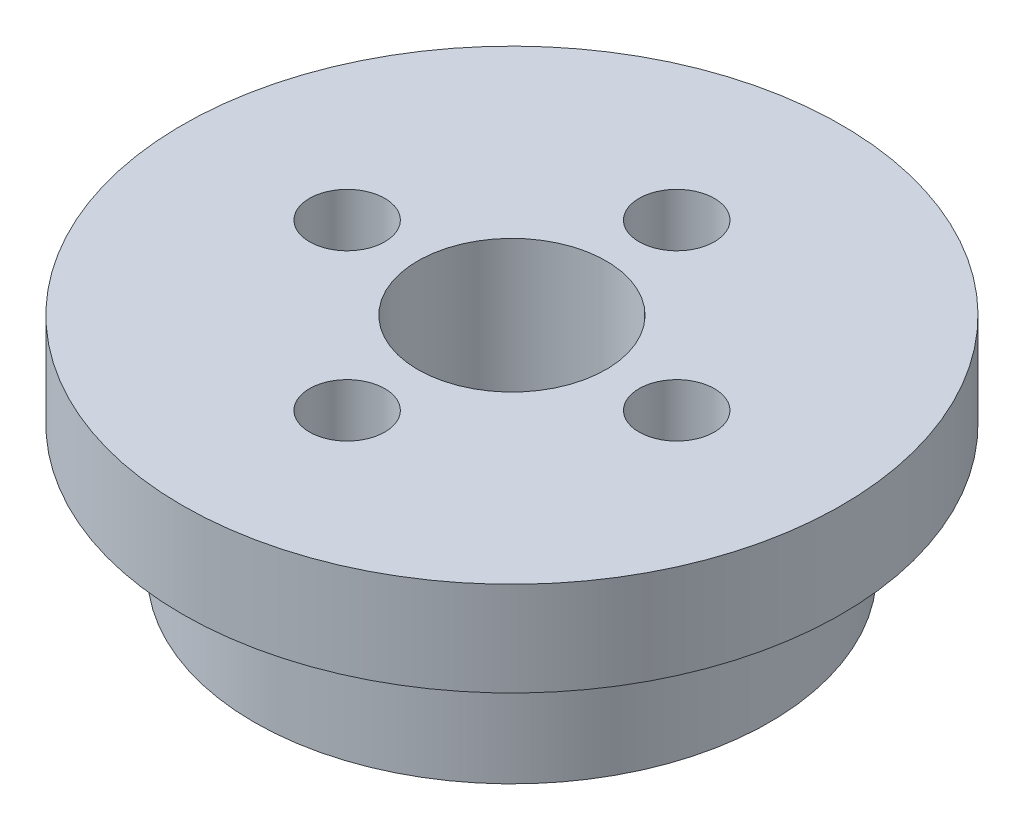
ISO-10303-21;
HEADER;
FILE_DESCRIPTION(('STEP AP214'),'2;1');
FILE_NAME('part.step','',(''),(''),'','','');
FILE_SCHEMA(('AUTOMOTIVE_DESIGN { 1 0 10303 214 1 1 1 1 }'));
ENDSEC;
DATA;
#1=APPLICATION_CONTEXT('core data for automotive mechanical design processes');
#2=APPLICATION_PROTOCOL_DEFINITION('international standard','automotive_design',2000,#1);
#3=PRODUCT_CONTEXT('',#1,'mechanical');
#4=PRODUCT('Part','Part','',(#3));
#5=PRODUCT_RELATED_PRODUCT_CATEGORY('part','',(#4));
#6=PRODUCT_DEFINITION_FORMATION('','',#4);
#7=PRODUCT_DEFINITION_CONTEXT('part definition',#1,'design');
#8=PRODUCT_DEFINITION('design','',#6,#7);
#9=PRODUCT_DEFINITION_SHAPE('','',#8);
#10=(LENGTH_UNIT() NAMED_UNIT(*) SI_UNIT(.MILLI.,.METRE.));
#11=(NAMED_UNIT(*) PLANE_ANGLE_UNIT() SI_UNIT($,.RADIAN.));
#12=(NAMED_UNIT(*) SI_UNIT($,.STERADIAN.) SOLID_ANGLE_UNIT());
#13=UNCERTAINTY_MEASURE_WITH_UNIT(LENGTH_MEASURE(1.E-05),#10,'distance_accuracy_value','');
#14=(GEOMETRIC_REPRESENTATION_CONTEXT(3) GLOBAL_UNCERTAINTY_ASSIGNED_CONTEXT((#13)) GLOBAL_UNIT_ASSIGNED_CONTEXT((#10,
#11,#12)) REPRESENTATION_CONTEXT('',''));
#15=CARTESIAN_POINT('',(0.,0.,0.));
#16=DIRECTION('',(0.,0.,1.));
#17=DIRECTION('',(1.,0.,0.));
#18=AXIS2_PLACEMENT_3D('',#15,#16,#17);
#19=CARTESIAN_POINT('',(0.,5.5,0.));
#20=DIRECTION('',(0.,-1.,0.));
#21=DIRECTION('',(0.,0.,-1.));
#22=AXIS2_PLACEMENT_3D('',#19,#20,#21);
#23=CYLINDRICAL_SURFACE('',#22,10.95);
#24=CARTESIAN_POINT('',(0.,5.5,0.));
#25=DIRECTION('',(0.,1.,0.));
#26=DIRECTION('',(0.,0.,1.));
#27=AXIS2_PLACEMENT_3D('',#24,#25,#26);
#28=CIRCLE('',#27,10.95);
#29=CARTESIAN_POINT('',(0.,5.5,10.95));
#30=VERTEX_POINT('',#29);
#31=EDGE_CURVE('E10',#30,#30,#28,.T.);
#32=ORIENTED_EDGE('',*,*,#31,.F.);
#33=EDGE_LOOP('',(#32));
#34=FACE_BOUND('',#33,.T.);
#35=CARTESIAN_POINT('',(0.,0.,0.));
#36=DIRECTION('',(0.,1.,0.));
#37=DIRECTION('',(0.,0.,1.));
#38=AXIS2_PLACEMENT_3D('',#35,#36,#37);
#39=CIRCLE('',#38,10.95);
#40=CARTESIAN_POINT('',(0.,0.,10.95));
#41=VERTEX_POINT('',#40);
#42=EDGE_CURVE('E36',#41,#41,#39,.T.);
#43=ORIENTED_EDGE('',*,*,#42,.T.);
#44=EDGE_LOOP('',(#43));
#45=FACE_BOUND('',#44,.T.);
#46=ADVANCED_FACE('F33',(#34,#45),#23,.T.);
#47=CARTESIAN_POINT('',(0.,0.,0.));
#48=DIRECTION('',(0.,1.,0.));
#49=DIRECTION('',(0.,0.,1.));
#50=AXIS2_PLACEMENT_3D('',#47,#48,#49);
#51=PLANE('',#50);
#52=CARTESIAN_POINT('',(-6.9999999999998,0.,1.99385646881822E-13));
#53=DIRECTION('',(0.,1.,0.));
#54=DIRECTION('',(0.,0.,1.));
#55=AXIS2_PLACEMENT_3D('',#52,#53,#54);
#56=CIRCLE('',#55,1.60000000000037);
#57=CARTESIAN_POINT('',(-6.9999999999998,0.,1.60000000000056));
#58=VERTEX_POINT('',#57);
#59=EDGE_CURVE('E56',#58,#58,#56,.T.);
#60=ORIENTED_EDGE('',*,*,#59,.T.);
#61=EDGE_LOOP('',(#60));
#62=FACE_BOUND('',#61,.T.);
#63=CARTESIAN_POINT('',(3.95765854616441E-13,0.,7.));
#64=DIRECTION('',(0.,1.,0.));
#65=DIRECTION('',(0.,0.,1.));
#66=AXIS2_PLACEMENT_3D('',#63,#64,#65);
#67=CIRCLE('',#66,1.60000000000047);
#68=CARTESIAN_POINT('',(3.95765854616441E-13,0.,8.60000000000047));
#69=VERTEX_POINT('',#68);
#70=EDGE_CURVE('E59',#69,#69,#67,.T.);
#71=ORIENTED_EDGE('',*,*,#70,.T.);
#72=EDGE_LOOP('',(#71));
#73=FACE_BOUND('',#72,.T.);
#74=CARTESIAN_POINT('',(7.0000000000002,0.,-1.98528394122419E-13));
#75=DIRECTION('',(0.,1.,0.));
#76=DIRECTION('',(0.,0.,1.));
#77=AXIS2_PLACEMENT_3D('',#74,#75,#76);
#78=CIRCLE('',#77,1.6000000000002);
#79=CARTESIAN_POINT('',(7.0000000000002,0.,1.6));
#80=VERTEX_POINT('',#79);
#81=EDGE_CURVE('E62',#80,#80,#78,.T.);
#82=ORIENTED_EDGE('',*,*,#81,.T.);
#83=EDGE_LOOP('',(#82));
#84=FACE_BOUND('',#83,.T.);
#85=CARTESIAN_POINT('',(0.,0.,-7.));
#86=DIRECTION('',(0.,1.,0.));
#87=DIRECTION('',(0.,0.,1.));
#88=AXIS2_PLACEMENT_3D('',#85,#86,#87);
#89=CIRCLE('',#88,1.6);
#90=CARTESIAN_POINT('',(0.,0.,-5.4));
#91=VERTEX_POINT('',#90);
#92=EDGE_CURVE('E65',#91,#91,#89,.T.);
#93=ORIENTED_EDGE('',*,*,#92,.T.);
#94=EDGE_LOOP('',(#93));
#95=FACE_BOUND('',#94,.T.);
#96=CARTESIAN_POINT('',(0.,0.,0.));
#97=DIRECTION('',(0.,1.,0.));
#98=DIRECTION('',(0.,0.,1.));
#99=AXIS2_PLACEMENT_3D('',#96,#97,#98);
#100=CIRCLE('',#99,4.);
#101=CARTESIAN_POINT('',(0.,0.,4.));
#102=VERTEX_POINT('',#101);
#103=EDGE_CURVE('E48',#102,#102,#100,.T.);
#104=ORIENTED_EDGE('',*,*,#103,.T.);
#105=EDGE_LOOP('',(#104));
#106=FACE_BOUND('',#105,.T.);
#107=ORIENTED_EDGE('',*,*,#42,.F.);
#108=EDGE_LOOP('',(#107));
#109=FACE_BOUND('',#108,.T.);
#110=ADVANCED_FACE('F101',(#62,#73,#84,#95,#106,#109),#51,.F.);
#111=CARTESIAN_POINT('',(0.,9.5,0.));
#112=DIRECTION('',(0.,-1.,0.));
#113=DIRECTION('',(0.,0.,-1.));
#114=AXIS2_PLACEMENT_3D('',#111,#112,#113);
#115=CYLINDRICAL_SURFACE('',#114,14.);
#116=CARTESIAN_POINT('',(0.,9.5,0.));
#117=DIRECTION('',(0.,1.,0.));
#118=DIRECTION('',(0.,0.,1.));
#119=AXIS2_PLACEMENT_3D('',#116,#117,#118);
#120=CIRCLE('',#119,14.);
#121=CARTESIAN_POINT('',(0.,9.5,14.));
#122=VERTEX_POINT('',#121);
#123=EDGE_CURVE('E43',#122,#122,#120,.T.);
#124=ORIENTED_EDGE('',*,*,#123,.F.);
#125=EDGE_LOOP('',(#124));
#126=FACE_BOUND('',#125,.T.);
#127=CARTESIAN_POINT('',(0.,5.5,0.));
#128=DIRECTION('',(0.,1.,0.));
#129=DIRECTION('',(0.,0.,1.));
#130=AXIS2_PLACEMENT_3D('',#127,#128,#129);
#131=CIRCLE('',#130,14.);
#132=CARTESIAN_POINT('',(0.,5.5,14.));
#133=VERTEX_POINT('',#132);
#134=EDGE_CURVE('E45',#133,#133,#131,.T.);
#135=ORIENTED_EDGE('',*,*,#134,.T.);
#136=EDGE_LOOP('',(#135));
#137=FACE_BOUND('',#136,.T.);
#138=ADVANCED_FACE('F88',(#126,#137),#115,.T.);
#139=CARTESIAN_POINT('',(0.,9.5,0.));
#140=DIRECTION('',(0.,1.,0.));
#141=DIRECTION('',(0.,0.,1.));
#142=AXIS2_PLACEMENT_3D('',#139,#140,#141);
#143=PLANE('',#142);
#144=CARTESIAN_POINT('',(-6.9999999999998,9.5,1.99385646881822E-13));
#145=DIRECTION('',(0.,1.,0.));
#146=DIRECTION('',(0.,0.,1.));
#147=AXIS2_PLACEMENT_3D('',#144,#145,#146);
#148=CIRCLE('',#147,1.60000000000037);
#149=CARTESIAN_POINT('',(-6.9999999999998,9.5,1.60000000000056));
#150=VERTEX_POINT('',#149);
#151=EDGE_CURVE('E75',#150,#150,#148,.T.);
#152=ORIENTED_EDGE('',*,*,#151,.F.);
#153=EDGE_LOOP('',(#152));
#154=FACE_BOUND('',#153,.T.);
#155=CARTESIAN_POINT('',(3.95765854616441E-13,9.5,7.));
#156=DIRECTION('',(0.,1.,0.));
#157=DIRECTION('',(0.,0.,1.));
#158=AXIS2_PLACEMENT_3D('',#155,#156,#157);
#159=CIRCLE('',#158,1.60000000000047);
#160=CARTESIAN_POINT('',(3.95765854616441E-13,9.5,8.60000000000047));
#161=VERTEX_POINT('',#160);
#162=EDGE_CURVE('E72',#161,#161,#159,.T.);
#163=ORIENTED_EDGE('',*,*,#162,.F.);
#164=EDGE_LOOP('',(#163));
#165=FACE_BOUND('',#164,.T.);
#166=CARTESIAN_POINT('',(7.0000000000002,9.5,-1.98528394122419E-13));
#167=DIRECTION('',(0.,1.,0.));
#168=DIRECTION('',(0.,0.,1.));
#169=AXIS2_PLACEMENT_3D('',#166,#167,#168);
#170=CIRCLE('',#169,1.6000000000002);
#171=CARTESIAN_POINT('',(7.0000000000002,9.5,1.6));
#172=VERTEX_POINT('',#171);
#173=EDGE_CURVE('E69',#172,#172,#170,.T.);
#174=ORIENTED_EDGE('',*,*,#173,.F.);
#175=EDGE_LOOP('',(#174));
#176=FACE_BOUND('',#175,.T.);
#177=CARTESIAN_POINT('',(0.,9.5,-7.));
#178=DIRECTION('',(0.,1.,0.));
#179=DIRECTION('',(0.,0.,1.));
#180=AXIS2_PLACEMENT_3D('',#177,#178,#179);
#181=CIRCLE('',#180,1.6);
#182=CARTESIAN_POINT('',(0.,9.5,-5.4));
#183=VERTEX_POINT('',#182);
#184=EDGE_CURVE('E68',#183,#183,#181,.T.);
#185=ORIENTED_EDGE('',*,*,#184,.F.);
#186=EDGE_LOOP('',(#185));
#187=FACE_BOUND('',#186,.T.);
#188=CARTESIAN_POINT('',(0.,9.5,0.));
#189=DIRECTION('',(0.,1.,0.));
#190=DIRECTION('',(0.,0.,1.));
#191=AXIS2_PLACEMENT_3D('',#188,#189,#190);
#192=CIRCLE('',#191,4.);
#193=CARTESIAN_POINT('',(0.,9.5,4.));
#194=VERTEX_POINT('',#193);
#195=EDGE_CURVE('E53',#194,#194,#192,.T.);
#196=ORIENTED_EDGE('',*,*,#195,.F.);
#197=EDGE_LOOP('',(#196));
#198=FACE_BOUND('',#197,.T.);
#199=ORIENTED_EDGE('',*,*,#123,.T.);
#200=EDGE_LOOP('',(#199));
#201=FACE_BOUND('',#200,.T.);
#202=ADVANCED_FACE('F84',(#154,#165,#176,#187,#198,#201),#143,.T.);
#203=CARTESIAN_POINT('',(0.,5.5,0.));
#204=DIRECTION('',(0.,1.,0.));
#205=DIRECTION('',(0.,0.,1.));
#206=AXIS2_PLACEMENT_3D('',#203,#204,#205);
#207=PLANE('',#206);
#208=ORIENTED_EDGE('',*,*,#31,.T.);
#209=EDGE_LOOP('',(#208));
#210=FACE_BOUND('',#209,.T.);
#211=ORIENTED_EDGE('',*,*,#134,.F.);
#212=EDGE_LOOP('',(#211));
#213=FACE_BOUND('',#212,.T.);
#214=ADVANCED_FACE('F87',(#210,#213),#207,.F.);
#215=CARTESIAN_POINT('',(0.,-40.5,0.));
#216=DIRECTION('',(0.,1.,0.));
#217=DIRECTION('',(0.,0.,1.));
#218=AXIS2_PLACEMENT_3D('',#215,#216,#217);
#219=CYLINDRICAL_SURFACE('',#218,4.);
#220=ORIENTED_EDGE('',*,*,#195,.T.);
#221=EDGE_LOOP('',(#220));
#222=FACE_BOUND('',#221,.T.);
#223=ORIENTED_EDGE('',*,*,#103,.F.);
#224=EDGE_LOOP('',(#223));
#225=FACE_BOUND('',#224,.T.);
#226=ADVANCED_FACE('F106',(#222,#225),#219,.F.);
#227=CARTESIAN_POINT('',(0.,-40.5,-7.));
#228=DIRECTION('',(0.,1.,0.));
#229=DIRECTION('',(0.,0.,1.));
#230=AXIS2_PLACEMENT_3D('',#227,#228,#229);
#231=CYLINDRICAL_SURFACE('',#230,1.6);
#232=ORIENTED_EDGE('',*,*,#184,.T.);
#233=EDGE_LOOP('',(#232));
#234=FACE_BOUND('',#233,.T.);
#235=ORIENTED_EDGE('',*,*,#92,.F.);
#236=EDGE_LOOP('',(#235));
#237=FACE_BOUND('',#236,.T.);
#238=ADVANCED_FACE('F111',(#234,#237),#231,.F.);
#239=CARTESIAN_POINT('',(7.0000000000002,-40.5,-1.98528394122419E-13));
#240=DIRECTION('',(0.,1.,0.));
#241=DIRECTION('',(0.,0.,1.));
#242=AXIS2_PLACEMENT_3D('',#239,#240,#241);
#243=CYLINDRICAL_SURFACE('',#242,1.6000000000002);
#244=ORIENTED_EDGE('',*,*,#173,.T.);
#245=EDGE_LOOP('',(#244));
#246=FACE_BOUND('',#245,.T.);
#247=ORIENTED_EDGE('',*,*,#81,.F.);
#248=EDGE_LOOP('',(#247));
#249=FACE_BOUND('',#248,.T.);
#250=ADVANCED_FACE('F137',(#246,#249),#243,.F.);
#251=CARTESIAN_POINT('',(3.95765854616441E-13,-40.5,7.));
#252=DIRECTION('',(0.,1.,0.));
#253=DIRECTION('',(0.,0.,1.));
#254=AXIS2_PLACEMENT_3D('',#251,#252,#253);
#255=CYLINDRICAL_SURFACE('',#254,1.60000000000047);
#256=ORIENTED_EDGE('',*,*,#162,.T.);
#257=EDGE_LOOP('',(#256));
#258=FACE_BOUND('',#257,.T.);
#259=ORIENTED_EDGE('',*,*,#70,.F.);
#260=EDGE_LOOP('',(#259));
#261=FACE_BOUND('',#260,.T.);
#262=ADVANCED_FACE('F81',(#258,#261),#255,.F.);
#263=CARTESIAN_POINT('',(-6.9999999999998,-40.5,1.99385646881822E-13));
#264=DIRECTION('',(0.,1.,0.));
#265=DIRECTION('',(0.,0.,1.));
#266=AXIS2_PLACEMENT_3D('',#263,#264,#265);
#267=CYLINDRICAL_SURFACE('',#266,1.60000000000037);
#268=ORIENTED_EDGE('',*,*,#151,.T.);
#269=EDGE_LOOP('',(#268));
#270=FACE_BOUND('',#269,.T.);
#271=ORIENTED_EDGE('',*,*,#59,.F.);
#272=EDGE_LOOP('',(#271));
#273=FACE_BOUND('',#272,.T.);
#274=ADVANCED_FACE('F146',(#270,#273),#267,.F.);
#275=CLOSED_SHELL('',(#46,#110,#138,#202,#214,#226,#238,#250,#262,#274));
#276=MANIFOLD_SOLID_BREP('B2',#275);
#277=ADVANCED_BREP_SHAPE_REPRESENTATION('',(#18,#276),#14);
#278=SHAPE_DEFINITION_REPRESENTATION(#9,#277);
ENDSEC;
END-ISO-10303-21;
